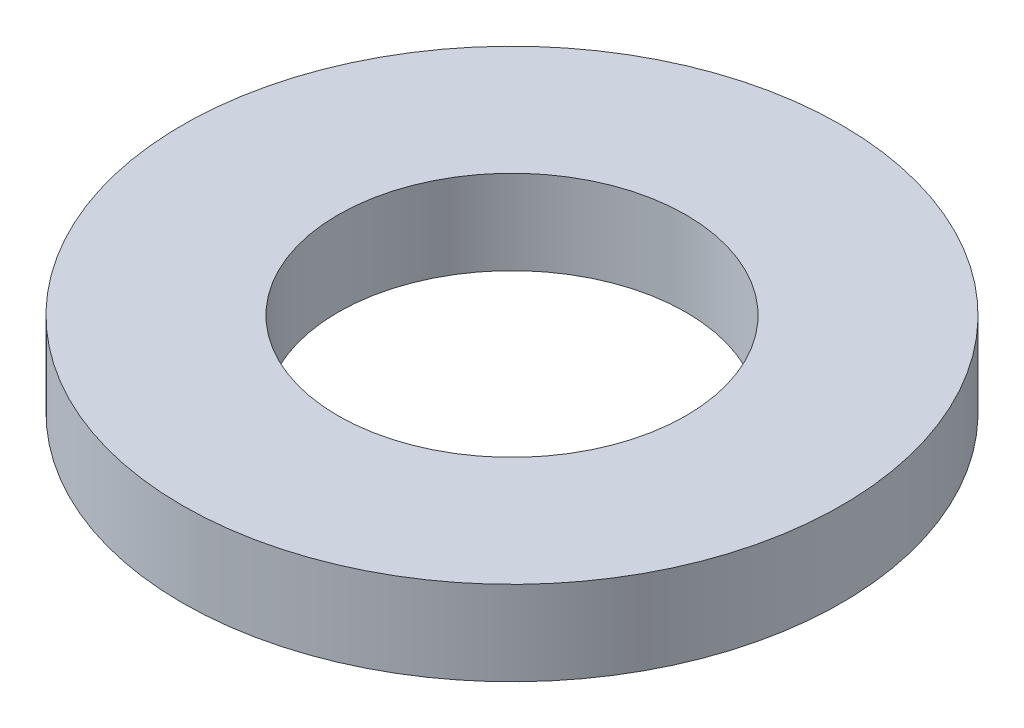
ISO-10303-21;
HEADER;
FILE_DESCRIPTION(('STEP AP214'),'2;1');
FILE_NAME('part.step','',(''),(''),'','','');
FILE_SCHEMA(('AUTOMOTIVE_DESIGN { 1 0 10303 214 1 1 1 1 }'));
ENDSEC;
DATA;
#1=APPLICATION_CONTEXT('core data for automotive mechanical design processes');
#2=APPLICATION_PROTOCOL_DEFINITION('international standard','automotive_design',2000,#1);
#3=PRODUCT_CONTEXT('',#1,'mechanical');
#4=PRODUCT('Part','Part','',(#3));
#5=PRODUCT_RELATED_PRODUCT_CATEGORY('part','',(#4));
#6=PRODUCT_DEFINITION_FORMATION('','',#4);
#7=PRODUCT_DEFINITION_CONTEXT('part definition',#1,'design');
#8=PRODUCT_DEFINITION('design','',#6,#7);
#9=PRODUCT_DEFINITION_SHAPE('','',#8);
#10=(LENGTH_UNIT() NAMED_UNIT(*) SI_UNIT(.MILLI.,.METRE.));
#11=(NAMED_UNIT(*) PLANE_ANGLE_UNIT() SI_UNIT($,.RADIAN.));
#12=(NAMED_UNIT(*) SI_UNIT($,.STERADIAN.) SOLID_ANGLE_UNIT());
#13=UNCERTAINTY_MEASURE_WITH_UNIT(LENGTH_MEASURE(1.E-05),#10,'distance_accuracy_value','');
#14=(GEOMETRIC_REPRESENTATION_CONTEXT(3) GLOBAL_UNCERTAINTY_ASSIGNED_CONTEXT((#13)) GLOBAL_UNIT_ASSIGNED_CONTEXT((#10,
#11,#12)) REPRESENTATION_CONTEXT('',''));
#15=CARTESIAN_POINT('',(0.,0.,0.));
#16=DIRECTION('',(0.,0.,1.));
#17=DIRECTION('',(1.,0.,0.));
#18=AXIS2_PLACEMENT_3D('',#15,#16,#17);
#19=CARTESIAN_POINT('',(0.,0.,0.));
#20=DIRECTION('',(0.,1.,0.));
#21=DIRECTION('',(0.,0.,1.));
#22=AXIS2_PLACEMENT_3D('',#19,#20,#21);
#23=CYLINDRICAL_SURFACE('',#22,3.3);
#24=CARTESIAN_POINT('',(0.,0.,0.));
#25=DIRECTION('',(0.,1.,0.));
#26=DIRECTION('',(0.,0.,1.));
#27=AXIS2_PLACEMENT_3D('',#24,#25,#26);
#28=CIRCLE('',#27,3.3);
#29=CARTESIAN_POINT('',(0.,0.,3.3));
#30=VERTEX_POINT('',#29);
#31=EDGE_CURVE('E10',#30,#30,#28,.T.);
#32=ORIENTED_EDGE('',*,*,#31,.T.);
#33=EDGE_LOOP('',(#32));
#34=FACE_BOUND('',#33,.T.);
#35=CARTESIAN_POINT('',(0.,-1.6,0.));
#36=DIRECTION('',(0.,1.,0.));
#37=DIRECTION('',(0.,0.,1.));
#38=AXIS2_PLACEMENT_3D('',#35,#36,#37);
#39=CIRCLE('',#38,3.3);
#40=CARTESIAN_POINT('',(0.,-1.6,3.3));
#41=VERTEX_POINT('',#40);
#42=EDGE_CURVE('E46',#41,#41,#39,.T.);
#43=ORIENTED_EDGE('',*,*,#42,.F.);
#44=EDGE_LOOP('',(#43));
#45=FACE_BOUND('',#44,.T.);
#46=ADVANCED_FACE('F32',(#34,#45),#23,.F.);
#47=CARTESIAN_POINT('',(3.3,0.,0.));
#48=DIRECTION('',(0.,1.,0.));
#49=DIRECTION('',(0.,0.,1.));
#50=AXIS2_PLACEMENT_3D('',#47,#48,#49);
#51=PLANE('',#50);
#52=CARTESIAN_POINT('',(0.,0.,0.));
#53=DIRECTION('',(0.,1.,0.));
#54=DIRECTION('',(0.,0.,1.));
#55=AXIS2_PLACEMENT_3D('',#52,#53,#54);
#56=CIRCLE('',#55,6.25);
#57=CARTESIAN_POINT('',(0.,0.,6.25));
#58=VERTEX_POINT('',#57);
#59=EDGE_CURVE('E38',#58,#58,#56,.T.);
#60=ORIENTED_EDGE('',*,*,#59,.T.);
#61=EDGE_LOOP('',(#60));
#62=FACE_BOUND('',#61,.T.);
#63=ORIENTED_EDGE('',*,*,#31,.F.);
#64=EDGE_LOOP('',(#63));
#65=FACE_BOUND('',#64,.T.);
#66=ADVANCED_FACE('F56',(#62,#65),#51,.T.);
#67=CARTESIAN_POINT('',(0.,0.,0.));
#68=DIRECTION('',(0.,1.,0.));
#69=DIRECTION('',(0.,0.,1.));
#70=AXIS2_PLACEMENT_3D('',#67,#68,#69);
#71=CYLINDRICAL_SURFACE('',#70,6.25);
#72=CARTESIAN_POINT('',(0.,-1.6,0.));
#73=DIRECTION('',(0.,1.,0.));
#74=DIRECTION('',(0.,0.,1.));
#75=AXIS2_PLACEMENT_3D('',#72,#73,#74);
#76=CIRCLE('',#75,6.25);
#77=CARTESIAN_POINT('',(0.,-1.6,6.25));
#78=VERTEX_POINT('',#77);
#79=EDGE_CURVE('E42',#78,#78,#76,.T.);
#80=ORIENTED_EDGE('',*,*,#79,.T.);
#81=EDGE_LOOP('',(#80));
#82=FACE_BOUND('',#81,.T.);
#83=ORIENTED_EDGE('',*,*,#59,.F.);
#84=EDGE_LOOP('',(#83));
#85=FACE_BOUND('',#84,.T.);
#86=ADVANCED_FACE('F60',(#82,#85),#71,.T.);
#87=CARTESIAN_POINT('',(3.3,-1.6,0.));
#88=DIRECTION('',(0.,-1.,0.));
#89=DIRECTION('',(0.,0.,-1.));
#90=AXIS2_PLACEMENT_3D('',#87,#88,#89);
#91=PLANE('',#90);
#92=ORIENTED_EDGE('',*,*,#42,.T.);
#93=EDGE_LOOP('',(#92));
#94=FACE_BOUND('',#93,.T.);
#95=ORIENTED_EDGE('',*,*,#79,.F.);
#96=EDGE_LOOP('',(#95));
#97=FACE_BOUND('',#96,.T.);
#98=ADVANCED_FACE('F52',(#94,#97),#91,.T.);
#99=CLOSED_SHELL('',(#46,#66,#86,#98));
#100=MANIFOLD_SOLID_BREP('B2',#99);
#101=ADVANCED_BREP_SHAPE_REPRESENTATION('',(#18,#100),#14);
#102=SHAPE_DEFINITION_REPRESENTATION(#9,#101);
ENDSEC;
END-ISO-10303-21;
